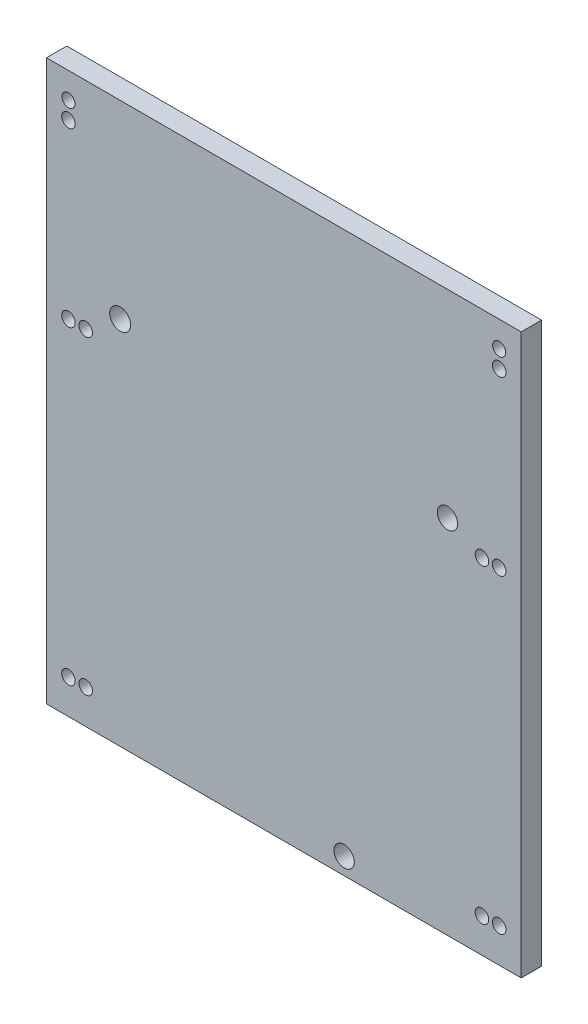
ISO-10303-21;
HEADER;
FILE_DESCRIPTION(('STEP AP214'),'2;1');
FILE_NAME('part.step','',(''),(''),'','','');
FILE_SCHEMA(('AUTOMOTIVE_DESIGN { 1 0 10303 214 1 1 1 1 }'));
ENDSEC;
DATA;
#1=APPLICATION_CONTEXT('core data for automotive mechanical design processes');
#2=APPLICATION_PROTOCOL_DEFINITION('international standard','automotive_design',2000,#1);
#3=PRODUCT_CONTEXT('',#1,'mechanical');
#4=PRODUCT('Part','Part','',(#3));
#5=PRODUCT_RELATED_PRODUCT_CATEGORY('part','',(#4));
#6=PRODUCT_DEFINITION_FORMATION('','',#4);
#7=PRODUCT_DEFINITION_CONTEXT('part definition',#1,'design');
#8=PRODUCT_DEFINITION('design','',#6,#7);
#9=PRODUCT_DEFINITION_SHAPE('','',#8);
#10=(LENGTH_UNIT() NAMED_UNIT(*) SI_UNIT(.MILLI.,.METRE.));
#11=(NAMED_UNIT(*) PLANE_ANGLE_UNIT() SI_UNIT($,.RADIAN.));
#12=(NAMED_UNIT(*) SI_UNIT($,.STERADIAN.) SOLID_ANGLE_UNIT());
#13=UNCERTAINTY_MEASURE_WITH_UNIT(LENGTH_MEASURE(1.E-05),#10,'distance_accuracy_value','');
#14=(GEOMETRIC_REPRESENTATION_CONTEXT(3) GLOBAL_UNCERTAINTY_ASSIGNED_CONTEXT((#13)) GLOBAL_UNIT_ASSIGNED_CONTEXT((#10,
#11,#12)) REPRESENTATION_CONTEXT('',''));
#15=CARTESIAN_POINT('',(0.,0.,0.));
#16=DIRECTION('',(0.,0.,1.));
#17=DIRECTION('',(1.,0.,0.));
#18=AXIS2_PLACEMENT_3D('',#15,#16,#17);
#19=CARTESIAN_POINT('',(0.,0.,3.));
#20=DIRECTION('',(0.,0.,-1.));
#21=DIRECTION('',(-1.,0.,0.));
#22=AXIS2_PLACEMENT_3D('',#19,#20,#21);
#23=PLANE('',#22);
#24=DIRECTION('',(0.,-1.,0.));
#25=VECTOR('',#24,1.);
#26=CARTESIAN_POINT('',(0.,0.,3.));
#27=LINE('',#26,#25);
#28=CARTESIAN_POINT('',(0.,82.5,3.));
#29=VERTEX_POINT('',#28);
#30=CARTESIAN_POINT('',(0.,0.,3.));
#31=VERTEX_POINT('',#30);
#32=EDGE_CURVE('E85',#29,#31,#27,.T.);
#33=ORIENTED_EDGE('',*,*,#32,.T.);
#34=DIRECTION('',(1.,0.,0.));
#35=VECTOR('',#34,1.);
#36=CARTESIAN_POINT('',(0.,0.,3.));
#37=LINE('',#36,#35);
#38=CARTESIAN_POINT('',(70.,0.,3.));
#39=VERTEX_POINT('',#38);
#40=EDGE_CURVE('E80',#31,#39,#37,.T.);
#41=ORIENTED_EDGE('',*,*,#40,.T.);
#42=DIRECTION('',(0.,1.,0.));
#43=VECTOR('',#42,1.);
#44=CARTESIAN_POINT('',(70.,0.,3.));
#45=LINE('',#44,#43);
#46=CARTESIAN_POINT('',(70.,82.5,3.));
#47=VERTEX_POINT('',#46);
#48=EDGE_CURVE('E83',#39,#47,#45,.T.);
#49=ORIENTED_EDGE('',*,*,#48,.T.);
#50=DIRECTION('',(-1.,0.,0.));
#51=VECTOR('',#50,1.);
#52=CARTESIAN_POINT('',(0.,82.5,3.));
#53=LINE('',#52,#51);
#54=EDGE_CURVE('E50',#47,#29,#53,.T.);
#55=ORIENTED_EDGE('',*,*,#54,.T.);
#56=EDGE_LOOP('',(#33,#41,#49,#55));
#57=FACE_BOUND('',#56,.T.);
#58=CARTESIAN_POINT('',(10.87,54.57,3.));
#59=DIRECTION('',(0.,0.,1.));
#60=DIRECTION('',(1.,0.,0.));
#61=AXIS2_PLACEMENT_3D('',#58,#59,#60);
#62=CIRCLE('',#61,1.54889262502123);
#63=CARTESIAN_POINT('',(12.4188926250212,54.57,3.));
#64=VERTEX_POINT('',#63);
#65=EDGE_CURVE('E100',#64,#64,#62,.T.);
#66=ORIENTED_EDGE('',*,*,#65,.F.);
#67=EDGE_LOOP('',(#66));
#68=FACE_BOUND('',#67,.T.);
#69=CARTESIAN_POINT('',(3.25,50.76,3.));
#70=DIRECTION('',(0.,0.,1.));
#71=DIRECTION('',(1.,0.,0.));
#72=AXIS2_PLACEMENT_3D('',#69,#70,#71);
#73=CIRCLE('',#72,1.);
#74=CARTESIAN_POINT('',(4.25,50.76,3.));
#75=VERTEX_POINT('',#74);
#76=EDGE_CURVE('E115',#75,#75,#73,.T.);
#77=ORIENTED_EDGE('',*,*,#76,.F.);
#78=EDGE_LOOP('',(#77));
#79=FACE_BOUND('',#78,.T.);
#80=CARTESIAN_POINT('',(59.13,53.3,3.));
#81=DIRECTION('',(0.,0.,1.));
#82=DIRECTION('',(1.,0.,0.));
#83=AXIS2_PLACEMENT_3D('',#80,#81,#82);
#84=CIRCLE('',#83,1.5);
#85=CARTESIAN_POINT('',(60.63,53.3,3.));
#86=VERTEX_POINT('',#85);
#87=EDGE_CURVE('E121',#86,#86,#84,.T.);
#88=ORIENTED_EDGE('',*,*,#87,.F.);
#89=EDGE_LOOP('',(#88));
#90=FACE_BOUND('',#89,.T.);
#91=CARTESIAN_POINT('',(43.89,2.5,3.));
#92=DIRECTION('',(0.,0.,1.));
#93=DIRECTION('',(1.,0.,0.));
#94=AXIS2_PLACEMENT_3D('',#91,#92,#93);
#95=CIRCLE('',#94,1.5);
#96=CARTESIAN_POINT('',(45.39,2.5,3.));
#97=VERTEX_POINT('',#96);
#98=EDGE_CURVE('E127',#97,#97,#95,.T.);
#99=ORIENTED_EDGE('',*,*,#98,.F.);
#100=EDGE_LOOP('',(#99));
#101=FACE_BOUND('',#100,.T.);
#102=CARTESIAN_POINT('',(3.25,78.7,3.));
#103=DIRECTION('',(0.,0.,1.));
#104=DIRECTION('',(1.,0.,0.));
#105=AXIS2_PLACEMENT_3D('',#102,#103,#104);
#106=CIRCLE('',#105,0.965612554052424);
#107=CARTESIAN_POINT('',(4.21561255405242,78.7,3.));
#108=VERTEX_POINT('',#107);
#109=EDGE_CURVE('E133',#108,#108,#106,.T.);
#110=ORIENTED_EDGE('',*,*,#109,.F.);
#111=EDGE_LOOP('',(#110));
#112=FACE_BOUND('',#111,.T.);
#113=CARTESIAN_POINT('',(3.25,76.16,3.));
#114=DIRECTION('',(0.,0.,1.));
#115=DIRECTION('',(1.,0.,0.));
#116=AXIS2_PLACEMENT_3D('',#113,#114,#115);
#117=CIRCLE('',#116,1.);
#118=CARTESIAN_POINT('',(4.25,76.16,3.));
#119=VERTEX_POINT('',#118);
#120=EDGE_CURVE('E139',#119,#119,#117,.T.);
#121=ORIENTED_EDGE('',*,*,#120,.F.);
#122=EDGE_LOOP('',(#121));
#123=FACE_BOUND('',#122,.T.);
#124=CARTESIAN_POINT('',(3.25,5.04,3.));
#125=DIRECTION('',(0.,0.,1.));
#126=DIRECTION('',(1.,0.,0.));
#127=AXIS2_PLACEMENT_3D('',#124,#125,#126);
#128=CIRCLE('',#127,1.);
#129=CARTESIAN_POINT('',(4.25,5.04,3.));
#130=VERTEX_POINT('',#129);
#131=EDGE_CURVE('E145',#130,#130,#128,.T.);
#132=ORIENTED_EDGE('',*,*,#131,.F.);
#133=EDGE_LOOP('',(#132));
#134=FACE_BOUND('',#133,.T.);
#135=CARTESIAN_POINT('',(66.75,78.7,3.));
#136=DIRECTION('',(0.,0.,1.));
#137=DIRECTION('',(1.,0.,0.));
#138=AXIS2_PLACEMENT_3D('',#135,#136,#137);
#139=CIRCLE('',#138,0.965612554052425);
#140=CARTESIAN_POINT('',(67.7156125540524,78.7,3.));
#141=VERTEX_POINT('',#140);
#142=EDGE_CURVE('E151',#141,#141,#139,.T.);
#143=ORIENTED_EDGE('',*,*,#142,.F.);
#144=EDGE_LOOP('',(#143));
#145=FACE_BOUND('',#144,.T.);
#146=CARTESIAN_POINT('',(66.75,76.16,3.));
#147=DIRECTION('',(0.,0.,1.));
#148=DIRECTION('',(1.,0.,0.));
#149=AXIS2_PLACEMENT_3D('',#146,#147,#148);
#150=CIRCLE('',#149,0.999999999999998);
#151=CARTESIAN_POINT('',(67.75,76.16,3.));
#152=VERTEX_POINT('',#151);
#153=EDGE_CURVE('E157',#152,#152,#150,.T.);
#154=ORIENTED_EDGE('',*,*,#153,.F.);
#155=EDGE_LOOP('',(#154));
#156=FACE_BOUND('',#155,.T.);
#157=CARTESIAN_POINT('',(5.79000000000001,5.04,3.));
#158=DIRECTION('',(0.,0.,1.));
#159=DIRECTION('',(1.,0.,0.));
#160=AXIS2_PLACEMENT_3D('',#157,#158,#159);
#161=CIRCLE('',#160,1.);
#162=CARTESIAN_POINT('',(6.79000000000001,5.04,3.));
#163=VERTEX_POINT('',#162);
#164=EDGE_CURVE('E163',#163,#163,#161,.T.);
#165=ORIENTED_EDGE('',*,*,#164,.F.);
#166=EDGE_LOOP('',(#165));
#167=FACE_BOUND('',#166,.T.);
#168=CARTESIAN_POINT('',(66.75,5.04,3.));
#169=DIRECTION('',(0.,0.,1.));
#170=DIRECTION('',(1.,0.,0.));
#171=AXIS2_PLACEMENT_3D('',#168,#169,#170);
#172=CIRCLE('',#171,0.999999999999998);
#173=CARTESIAN_POINT('',(67.75,5.04,3.));
#174=VERTEX_POINT('',#173);
#175=EDGE_CURVE('E169',#174,#174,#172,.T.);
#176=ORIENTED_EDGE('',*,*,#175,.F.);
#177=EDGE_LOOP('',(#176));
#178=FACE_BOUND('',#177,.T.);
#179=CARTESIAN_POINT('',(64.21,5.04,3.));
#180=DIRECTION('',(0.,0.,1.));
#181=DIRECTION('',(1.,0.,0.));
#182=AXIS2_PLACEMENT_3D('',#179,#180,#181);
#183=CIRCLE('',#182,1.00000000000001);
#184=CARTESIAN_POINT('',(65.21,5.04,3.));
#185=VERTEX_POINT('',#184);
#186=EDGE_CURVE('E175',#185,#185,#183,.T.);
#187=ORIENTED_EDGE('',*,*,#186,.F.);
#188=EDGE_LOOP('',(#187));
#189=FACE_BOUND('',#188,.T.);
#190=CARTESIAN_POINT('',(5.79,50.76,3.));
#191=DIRECTION('',(0.,0.,1.));
#192=DIRECTION('',(1.,0.,0.));
#193=AXIS2_PLACEMENT_3D('',#190,#191,#192);
#194=CIRCLE('',#193,1.);
#195=CARTESIAN_POINT('',(6.79,50.76,3.));
#196=VERTEX_POINT('',#195);
#197=EDGE_CURVE('E181',#196,#196,#194,.T.);
#198=ORIENTED_EDGE('',*,*,#197,.F.);
#199=EDGE_LOOP('',(#198));
#200=FACE_BOUND('',#199,.T.);
#201=CARTESIAN_POINT('',(66.75,50.76,3.));
#202=DIRECTION('',(0.,0.,1.));
#203=DIRECTION('',(1.,0.,0.));
#204=AXIS2_PLACEMENT_3D('',#201,#202,#203);
#205=CIRCLE('',#204,0.999999999999998);
#206=CARTESIAN_POINT('',(67.75,50.76,3.));
#207=VERTEX_POINT('',#206);
#208=EDGE_CURVE('E187',#207,#207,#205,.T.);
#209=ORIENTED_EDGE('',*,*,#208,.F.);
#210=EDGE_LOOP('',(#209));
#211=FACE_BOUND('',#210,.T.);
#212=CARTESIAN_POINT('',(64.21,50.76,3.));
#213=DIRECTION('',(0.,0.,1.));
#214=DIRECTION('',(1.,0.,0.));
#215=AXIS2_PLACEMENT_3D('',#212,#213,#214);
#216=CIRCLE('',#215,0.999999999999998);
#217=CARTESIAN_POINT('',(65.21,50.76,3.));
#218=VERTEX_POINT('',#217);
#219=EDGE_CURVE('E193',#218,#218,#216,.T.);
#220=ORIENTED_EDGE('',*,*,#219,.F.);
#221=EDGE_LOOP('',(#220));
#222=FACE_BOUND('',#221,.T.);
#223=ADVANCED_FACE('F33',(#57,#68,#79,#90,#101,#112,#123,#134,#145,#156,#167,#178,#189,#200,
#211,#222),#23,.F.);
#224=CARTESIAN_POINT('',(0.,0.,0.));
#225=DIRECTION('',(0.,0.,-1.));
#226=DIRECTION('',(-1.,0.,0.));
#227=AXIS2_PLACEMENT_3D('',#224,#225,#226);
#228=PLANE('',#227);
#229=CARTESIAN_POINT('',(66.75,50.76,0.));
#230=DIRECTION('',(0.,0.,1.));
#231=DIRECTION('',(1.,0.,0.));
#232=AXIS2_PLACEMENT_3D('',#229,#230,#231);
#233=CIRCLE('',#232,0.999999999999998);
#234=CARTESIAN_POINT('',(67.75,50.76,0.));
#235=VERTEX_POINT('',#234);
#236=EDGE_CURVE('E190',#235,#235,#233,.T.);
#237=ORIENTED_EDGE('',*,*,#236,.T.);
#238=EDGE_LOOP('',(#237));
#239=FACE_BOUND('',#238,.T.);
#240=CARTESIAN_POINT('',(64.21,5.04,0.));
#241=DIRECTION('',(0.,0.,1.));
#242=DIRECTION('',(1.,0.,0.));
#243=AXIS2_PLACEMENT_3D('',#240,#241,#242);
#244=CIRCLE('',#243,1.00000000000001);
#245=CARTESIAN_POINT('',(65.21,5.04,0.));
#246=VERTEX_POINT('',#245);
#247=EDGE_CURVE('E178',#246,#246,#244,.T.);
#248=ORIENTED_EDGE('',*,*,#247,.T.);
#249=EDGE_LOOP('',(#248));
#250=FACE_BOUND('',#249,.T.);
#251=CARTESIAN_POINT('',(5.79000000000001,5.04,0.));
#252=DIRECTION('',(0.,0.,1.));
#253=DIRECTION('',(1.,0.,0.));
#254=AXIS2_PLACEMENT_3D('',#251,#252,#253);
#255=CIRCLE('',#254,1.);
#256=CARTESIAN_POINT('',(6.79000000000001,5.04,0.));
#257=VERTEX_POINT('',#256);
#258=EDGE_CURVE('E166',#257,#257,#255,.T.);
#259=ORIENTED_EDGE('',*,*,#258,.T.);
#260=EDGE_LOOP('',(#259));
#261=FACE_BOUND('',#260,.T.);
#262=CARTESIAN_POINT('',(66.75,78.7,0.));
#263=DIRECTION('',(0.,0.,1.));
#264=DIRECTION('',(1.,0.,0.));
#265=AXIS2_PLACEMENT_3D('',#262,#263,#264);
#266=CIRCLE('',#265,0.965612554052425);
#267=CARTESIAN_POINT('',(67.7156125540524,78.7,0.));
#268=VERTEX_POINT('',#267);
#269=EDGE_CURVE('E154',#268,#268,#266,.T.);
#270=ORIENTED_EDGE('',*,*,#269,.T.);
#271=EDGE_LOOP('',(#270));
#272=FACE_BOUND('',#271,.T.);
#273=CARTESIAN_POINT('',(3.25,76.16,0.));
#274=DIRECTION('',(0.,0.,1.));
#275=DIRECTION('',(1.,0.,0.));
#276=AXIS2_PLACEMENT_3D('',#273,#274,#275);
#277=CIRCLE('',#276,1.);
#278=CARTESIAN_POINT('',(4.25,76.16,0.));
#279=VERTEX_POINT('',#278);
#280=EDGE_CURVE('E142',#279,#279,#277,.T.);
#281=ORIENTED_EDGE('',*,*,#280,.T.);
#282=EDGE_LOOP('',(#281));
#283=FACE_BOUND('',#282,.T.);
#284=CARTESIAN_POINT('',(43.89,2.5,0.));
#285=DIRECTION('',(0.,0.,1.));
#286=DIRECTION('',(1.,0.,0.));
#287=AXIS2_PLACEMENT_3D('',#284,#285,#286);
#288=CIRCLE('',#287,1.5);
#289=CARTESIAN_POINT('',(45.39,2.5,0.));
#290=VERTEX_POINT('',#289);
#291=EDGE_CURVE('E130',#290,#290,#288,.T.);
#292=ORIENTED_EDGE('',*,*,#291,.T.);
#293=EDGE_LOOP('',(#292));
#294=FACE_BOUND('',#293,.T.);
#295=CARTESIAN_POINT('',(3.25,50.76,0.));
#296=DIRECTION('',(0.,0.,1.));
#297=DIRECTION('',(1.,0.,0.));
#298=AXIS2_PLACEMENT_3D('',#295,#296,#297);
#299=CIRCLE('',#298,1.);
#300=CARTESIAN_POINT('',(4.25,50.76,0.));
#301=VERTEX_POINT('',#300);
#302=EDGE_CURVE('E118',#301,#301,#299,.T.);
#303=ORIENTED_EDGE('',*,*,#302,.T.);
#304=EDGE_LOOP('',(#303));
#305=FACE_BOUND('',#304,.T.);
#306=DIRECTION('',(0.,-1.,0.));
#307=VECTOR('',#306,1.);
#308=CARTESIAN_POINT('',(0.,0.,0.));
#309=LINE('',#308,#307);
#310=CARTESIAN_POINT('',(0.,82.5,0.));
#311=VERTEX_POINT('',#310);
#312=CARTESIAN_POINT('',(0.,0.,0.));
#313=VERTEX_POINT('',#312);
#314=EDGE_CURVE('E97',#311,#313,#309,.T.);
#315=ORIENTED_EDGE('',*,*,#314,.F.);
#316=DIRECTION('',(-1.,0.,0.));
#317=VECTOR('',#316,1.);
#318=CARTESIAN_POINT('',(0.,82.5,0.));
#319=LINE('',#318,#317);
#320=CARTESIAN_POINT('',(70.,82.5,0.));
#321=VERTEX_POINT('',#320);
#322=EDGE_CURVE('E73',#321,#311,#319,.T.);
#323=ORIENTED_EDGE('',*,*,#322,.F.);
#324=DIRECTION('',(0.,1.,0.));
#325=VECTOR('',#324,1.);
#326=CARTESIAN_POINT('',(70.,0.,0.));
#327=LINE('',#326,#325);
#328=CARTESIAN_POINT('',(70.,0.,0.));
#329=VERTEX_POINT('',#328);
#330=EDGE_CURVE('E67',#329,#321,#327,.T.);
#331=ORIENTED_EDGE('',*,*,#330,.F.);
#332=DIRECTION('',(1.,0.,0.));
#333=VECTOR('',#332,1.);
#334=CARTESIAN_POINT('',(0.,0.,0.));
#335=LINE('',#334,#333);
#336=EDGE_CURVE('E89',#313,#329,#335,.T.);
#337=ORIENTED_EDGE('',*,*,#336,.F.);
#338=EDGE_LOOP('',(#315,#323,#331,#337));
#339=FACE_BOUND('',#338,.T.);
#340=CARTESIAN_POINT('',(10.87,54.57,0.));
#341=DIRECTION('',(0.,0.,1.));
#342=DIRECTION('',(1.,0.,0.));
#343=AXIS2_PLACEMENT_3D('',#340,#341,#342);
#344=CIRCLE('',#343,1.54889262502123);
#345=CARTESIAN_POINT('',(12.4188926250212,54.57,0.));
#346=VERTEX_POINT('',#345);
#347=EDGE_CURVE('E112',#346,#346,#344,.T.);
#348=ORIENTED_EDGE('',*,*,#347,.T.);
#349=EDGE_LOOP('',(#348));
#350=FACE_BOUND('',#349,.T.);
#351=CARTESIAN_POINT('',(59.13,53.3,0.));
#352=DIRECTION('',(0.,0.,1.));
#353=DIRECTION('',(1.,0.,0.));
#354=AXIS2_PLACEMENT_3D('',#351,#352,#353);
#355=CIRCLE('',#354,1.5);
#356=CARTESIAN_POINT('',(60.63,53.3,0.));
#357=VERTEX_POINT('',#356);
#358=EDGE_CURVE('E124',#357,#357,#355,.T.);
#359=ORIENTED_EDGE('',*,*,#358,.T.);
#360=EDGE_LOOP('',(#359));
#361=FACE_BOUND('',#360,.T.);
#362=CARTESIAN_POINT('',(3.25,78.7,0.));
#363=DIRECTION('',(0.,0.,1.));
#364=DIRECTION('',(1.,0.,0.));
#365=AXIS2_PLACEMENT_3D('',#362,#363,#364);
#366=CIRCLE('',#365,0.965612554052424);
#367=CARTESIAN_POINT('',(4.21561255405242,78.7,0.));
#368=VERTEX_POINT('',#367);
#369=EDGE_CURVE('E136',#368,#368,#366,.T.);
#370=ORIENTED_EDGE('',*,*,#369,.T.);
#371=EDGE_LOOP('',(#370));
#372=FACE_BOUND('',#371,.T.);
#373=CARTESIAN_POINT('',(3.25,5.04,0.));
#374=DIRECTION('',(0.,0.,1.));
#375=DIRECTION('',(1.,0.,0.));
#376=AXIS2_PLACEMENT_3D('',#373,#374,#375);
#377=CIRCLE('',#376,1.);
#378=CARTESIAN_POINT('',(4.25,5.04,0.));
#379=VERTEX_POINT('',#378);
#380=EDGE_CURVE('E148',#379,#379,#377,.T.);
#381=ORIENTED_EDGE('',*,*,#380,.T.);
#382=EDGE_LOOP('',(#381));
#383=FACE_BOUND('',#382,.T.);
#384=CARTESIAN_POINT('',(66.75,76.16,0.));
#385=DIRECTION('',(0.,0.,1.));
#386=DIRECTION('',(1.,0.,0.));
#387=AXIS2_PLACEMENT_3D('',#384,#385,#386);
#388=CIRCLE('',#387,0.999999999999998);
#389=CARTESIAN_POINT('',(67.75,76.16,0.));
#390=VERTEX_POINT('',#389);
#391=EDGE_CURVE('E160',#390,#390,#388,.T.);
#392=ORIENTED_EDGE('',*,*,#391,.T.);
#393=EDGE_LOOP('',(#392));
#394=FACE_BOUND('',#393,.T.);
#395=CARTESIAN_POINT('',(66.75,5.04,0.));
#396=DIRECTION('',(0.,0.,1.));
#397=DIRECTION('',(1.,0.,0.));
#398=AXIS2_PLACEMENT_3D('',#395,#396,#397);
#399=CIRCLE('',#398,0.999999999999998);
#400=CARTESIAN_POINT('',(67.75,5.04,0.));
#401=VERTEX_POINT('',#400);
#402=EDGE_CURVE('E172',#401,#401,#399,.T.);
#403=ORIENTED_EDGE('',*,*,#402,.T.);
#404=EDGE_LOOP('',(#403));
#405=FACE_BOUND('',#404,.T.);
#406=CARTESIAN_POINT('',(5.79,50.76,0.));
#407=DIRECTION('',(0.,0.,1.));
#408=DIRECTION('',(1.,0.,0.));
#409=AXIS2_PLACEMENT_3D('',#406,#407,#408);
#410=CIRCLE('',#409,1.);
#411=CARTESIAN_POINT('',(6.79,50.76,0.));
#412=VERTEX_POINT('',#411);
#413=EDGE_CURVE('E184',#412,#412,#410,.T.);
#414=ORIENTED_EDGE('',*,*,#413,.T.);
#415=EDGE_LOOP('',(#414));
#416=FACE_BOUND('',#415,.T.);
#417=CARTESIAN_POINT('',(64.21,50.76,0.));
#418=DIRECTION('',(0.,0.,1.));
#419=DIRECTION('',(1.,0.,0.));
#420=AXIS2_PLACEMENT_3D('',#417,#418,#419);
#421=CIRCLE('',#420,0.999999999999998);
#422=CARTESIAN_POINT('',(65.21,50.76,0.));
#423=VERTEX_POINT('',#422);
#424=EDGE_CURVE('E196',#423,#423,#421,.T.);
#425=ORIENTED_EDGE('',*,*,#424,.T.);
#426=EDGE_LOOP('',(#425));
#427=FACE_BOUND('',#426,.T.);
#428=ADVANCED_FACE('F108',(#239,#250,#261,#272,#283,#294,#305,#339,#350,#361,#372,#383,#394,
#405,#416,#427),#228,.T.);
#429=CARTESIAN_POINT('',(0.,0.,3.));
#430=DIRECTION('',(1.,0.,0.));
#431=DIRECTION('',(0.,0.,-1.));
#432=AXIS2_PLACEMENT_3D('',#429,#430,#431);
#433=PLANE('',#432);
#434=ORIENTED_EDGE('',*,*,#314,.T.);
#435=DIRECTION('',(0.,0.,-1.));
#436=VECTOR('',#435,1.);
#437=CARTESIAN_POINT('',(0.,0.,3.));
#438=LINE('',#437,#436);
#439=EDGE_CURVE('E11',#31,#313,#438,.T.);
#440=ORIENTED_EDGE('',*,*,#439,.F.);
#441=ORIENTED_EDGE('',*,*,#32,.F.);
#442=DIRECTION('',(0.,0.,-1.));
#443=VECTOR('',#442,1.);
#444=CARTESIAN_POINT('',(0.,82.5,3.));
#445=LINE('',#444,#443);
#446=EDGE_CURVE('E93',#29,#311,#445,.T.);
#447=ORIENTED_EDGE('',*,*,#446,.T.);
#448=EDGE_LOOP('',(#434,#440,#441,#447));
#449=FACE_BOUND('',#448,.T.);
#450=ADVANCED_FACE('F35',(#449),#433,.F.);
#451=CARTESIAN_POINT('',(0.,0.,3.));
#452=DIRECTION('',(0.,1.,0.));
#453=DIRECTION('',(0.,0.,1.));
#454=AXIS2_PLACEMENT_3D('',#451,#452,#453);
#455=PLANE('',#454);
#456=ORIENTED_EDGE('',*,*,#336,.T.);
#457=DIRECTION('',(0.,0.,-1.));
#458=VECTOR('',#457,1.);
#459=CARTESIAN_POINT('',(70.,0.,3.));
#460=LINE('',#459,#458);
#461=EDGE_CURVE('E42',#39,#329,#460,.T.);
#462=ORIENTED_EDGE('',*,*,#461,.F.);
#463=ORIENTED_EDGE('',*,*,#40,.F.);
#464=ORIENTED_EDGE('',*,*,#439,.T.);
#465=EDGE_LOOP('',(#456,#462,#463,#464));
#466=FACE_BOUND('',#465,.T.);
#467=ADVANCED_FACE('F88',(#466),#455,.F.);
#468=CARTESIAN_POINT('',(70.,0.,3.));
#469=DIRECTION('',(-1.,0.,0.));
#470=DIRECTION('',(0.,0.,1.));
#471=AXIS2_PLACEMENT_3D('',#468,#469,#470);
#472=PLANE('',#471);
#473=ORIENTED_EDGE('',*,*,#330,.T.);
#474=DIRECTION('',(0.,0.,-1.));
#475=VECTOR('',#474,1.);
#476=CARTESIAN_POINT('',(70.,82.5,3.));
#477=LINE('',#476,#475);
#478=EDGE_CURVE('E90',#47,#321,#477,.T.);
#479=ORIENTED_EDGE('',*,*,#478,.F.);
#480=ORIENTED_EDGE('',*,*,#48,.F.);
#481=ORIENTED_EDGE('',*,*,#461,.T.);
#482=EDGE_LOOP('',(#473,#479,#480,#481));
#483=FACE_BOUND('',#482,.T.);
#484=ADVANCED_FACE('F91',(#483),#472,.F.);
#485=CARTESIAN_POINT('',(0.,82.5,3.));
#486=DIRECTION('',(0.,-1.,0.));
#487=DIRECTION('',(0.,0.,-1.));
#488=AXIS2_PLACEMENT_3D('',#485,#486,#487);
#489=PLANE('',#488);
#490=ORIENTED_EDGE('',*,*,#322,.T.);
#491=ORIENTED_EDGE('',*,*,#446,.F.);
#492=ORIENTED_EDGE('',*,*,#54,.F.);
#493=ORIENTED_EDGE('',*,*,#478,.T.);
#494=EDGE_LOOP('',(#490,#491,#492,#493));
#495=FACE_BOUND('',#494,.T.);
#496=ADVANCED_FACE('F105',(#495),#489,.F.);
#497=CARTESIAN_POINT('',(10.87,54.57,3.));
#498=DIRECTION('',(0.,0.,-1.));
#499=DIRECTION('',(-1.,0.,0.));
#500=AXIS2_PLACEMENT_3D('',#497,#498,#499);
#501=CYLINDRICAL_SURFACE('',#500,1.54889262502123);
#502=ORIENTED_EDGE('',*,*,#65,.T.);
#503=EDGE_LOOP('',(#502));
#504=FACE_BOUND('',#503,.T.);
#505=ORIENTED_EDGE('',*,*,#347,.F.);
#506=EDGE_LOOP('',(#505));
#507=FACE_BOUND('',#506,.T.);
#508=ADVANCED_FACE('F213',(#504,#507),#501,.F.);
#509=CARTESIAN_POINT('',(3.25,50.76,3.));
#510=DIRECTION('',(0.,0.,-1.));
#511=DIRECTION('',(-1.,0.,0.));
#512=AXIS2_PLACEMENT_3D('',#509,#510,#511);
#513=CYLINDRICAL_SURFACE('',#512,1.);
#514=ORIENTED_EDGE('',*,*,#76,.T.);
#515=EDGE_LOOP('',(#514));
#516=FACE_BOUND('',#515,.T.);
#517=ORIENTED_EDGE('',*,*,#302,.F.);
#518=EDGE_LOOP('',(#517));
#519=FACE_BOUND('',#518,.T.);
#520=ADVANCED_FACE('F259',(#516,#519),#513,.F.);
#521=CARTESIAN_POINT('',(59.13,53.3,3.));
#522=DIRECTION('',(0.,0.,-1.));
#523=DIRECTION('',(-1.,0.,0.));
#524=AXIS2_PLACEMENT_3D('',#521,#522,#523);
#525=CYLINDRICAL_SURFACE('',#524,1.5);
#526=ORIENTED_EDGE('',*,*,#87,.T.);
#527=EDGE_LOOP('',(#526));
#528=FACE_BOUND('',#527,.T.);
#529=ORIENTED_EDGE('',*,*,#358,.F.);
#530=EDGE_LOOP('',(#529));
#531=FACE_BOUND('',#530,.T.);
#532=ADVANCED_FACE('F267',(#528,#531),#525,.F.);
#533=CARTESIAN_POINT('',(43.89,2.5,3.));
#534=DIRECTION('',(0.,0.,-1.));
#535=DIRECTION('',(-1.,0.,0.));
#536=AXIS2_PLACEMENT_3D('',#533,#534,#535);
#537=CYLINDRICAL_SURFACE('',#536,1.5);
#538=ORIENTED_EDGE('',*,*,#98,.T.);
#539=EDGE_LOOP('',(#538));
#540=FACE_BOUND('',#539,.T.);
#541=ORIENTED_EDGE('',*,*,#291,.F.);
#542=EDGE_LOOP('',(#541));
#543=FACE_BOUND('',#542,.T.);
#544=ADVANCED_FACE('F275',(#540,#543),#537,.F.);
#545=CARTESIAN_POINT('',(3.25,78.7,3.));
#546=DIRECTION('',(0.,0.,-1.));
#547=DIRECTION('',(-1.,0.,0.));
#548=AXIS2_PLACEMENT_3D('',#545,#546,#547);
#549=CYLINDRICAL_SURFACE('',#548,0.965612554052424);
#550=ORIENTED_EDGE('',*,*,#109,.T.);
#551=EDGE_LOOP('',(#550));
#552=FACE_BOUND('',#551,.T.);
#553=ORIENTED_EDGE('',*,*,#369,.F.);
#554=EDGE_LOOP('',(#553));
#555=FACE_BOUND('',#554,.T.);
#556=ADVANCED_FACE('F284',(#552,#555),#549,.F.);
#557=CARTESIAN_POINT('',(3.25,76.16,3.));
#558=DIRECTION('',(0.,0.,-1.));
#559=DIRECTION('',(-1.,0.,0.));
#560=AXIS2_PLACEMENT_3D('',#557,#558,#559);
#561=CYLINDRICAL_SURFACE('',#560,1.);
#562=ORIENTED_EDGE('',*,*,#120,.T.);
#563=EDGE_LOOP('',(#562));
#564=FACE_BOUND('',#563,.T.);
#565=ORIENTED_EDGE('',*,*,#280,.F.);
#566=EDGE_LOOP('',(#565));
#567=FACE_BOUND('',#566,.T.);
#568=ADVANCED_FACE('F293',(#564,#567),#561,.F.);
#569=CARTESIAN_POINT('',(3.25,5.04,3.));
#570=DIRECTION('',(0.,0.,-1.));
#571=DIRECTION('',(-1.,0.,0.));
#572=AXIS2_PLACEMENT_3D('',#569,#570,#571);
#573=CYLINDRICAL_SURFACE('',#572,1.);
#574=ORIENTED_EDGE('',*,*,#131,.T.);
#575=EDGE_LOOP('',(#574));
#576=FACE_BOUND('',#575,.T.);
#577=ORIENTED_EDGE('',*,*,#380,.F.);
#578=EDGE_LOOP('',(#577));
#579=FACE_BOUND('',#578,.T.);
#580=ADVANCED_FACE('F302',(#576,#579),#573,.F.);
#581=CARTESIAN_POINT('',(66.75,78.7,3.));
#582=DIRECTION('',(0.,0.,-1.));
#583=DIRECTION('',(-1.,0.,0.));
#584=AXIS2_PLACEMENT_3D('',#581,#582,#583);
#585=CYLINDRICAL_SURFACE('',#584,0.965612554052425);
#586=ORIENTED_EDGE('',*,*,#142,.T.);
#587=EDGE_LOOP('',(#586));
#588=FACE_BOUND('',#587,.T.);
#589=ORIENTED_EDGE('',*,*,#269,.F.);
#590=EDGE_LOOP('',(#589));
#591=FACE_BOUND('',#590,.T.);
#592=ADVANCED_FACE('F311',(#588,#591),#585,.F.);
#593=CARTESIAN_POINT('',(66.75,76.16,3.));
#594=DIRECTION('',(0.,0.,-1.));
#595=DIRECTION('',(-1.,0.,0.));
#596=AXIS2_PLACEMENT_3D('',#593,#594,#595);
#597=CYLINDRICAL_SURFACE('',#596,0.999999999999998);
#598=ORIENTED_EDGE('',*,*,#153,.T.);
#599=EDGE_LOOP('',(#598));
#600=FACE_BOUND('',#599,.T.);
#601=ORIENTED_EDGE('',*,*,#391,.F.);
#602=EDGE_LOOP('',(#601));
#603=FACE_BOUND('',#602,.T.);
#604=ADVANCED_FACE('F320',(#600,#603),#597,.F.);
#605=CARTESIAN_POINT('',(5.79000000000001,5.04,3.));
#606=DIRECTION('',(0.,0.,-1.));
#607=DIRECTION('',(-1.,0.,0.));
#608=AXIS2_PLACEMENT_3D('',#605,#606,#607);
#609=CYLINDRICAL_SURFACE('',#608,1.);
#610=ORIENTED_EDGE('',*,*,#164,.T.);
#611=EDGE_LOOP('',(#610));
#612=FACE_BOUND('',#611,.T.);
#613=ORIENTED_EDGE('',*,*,#258,.F.);
#614=EDGE_LOOP('',(#613));
#615=FACE_BOUND('',#614,.T.);
#616=ADVANCED_FACE('F329',(#612,#615),#609,.F.);
#617=CARTESIAN_POINT('',(66.75,5.04,3.));
#618=DIRECTION('',(0.,0.,-1.));
#619=DIRECTION('',(-1.,0.,0.));
#620=AXIS2_PLACEMENT_3D('',#617,#618,#619);
#621=CYLINDRICAL_SURFACE('',#620,0.999999999999998);
#622=ORIENTED_EDGE('',*,*,#175,.T.);
#623=EDGE_LOOP('',(#622));
#624=FACE_BOUND('',#623,.T.);
#625=ORIENTED_EDGE('',*,*,#402,.F.);
#626=EDGE_LOOP('',(#625));
#627=FACE_BOUND('',#626,.T.);
#628=ADVANCED_FACE('F338',(#624,#627),#621,.F.);
#629=CARTESIAN_POINT('',(64.21,5.04,3.));
#630=DIRECTION('',(0.,0.,-1.));
#631=DIRECTION('',(-1.,0.,0.));
#632=AXIS2_PLACEMENT_3D('',#629,#630,#631);
#633=CYLINDRICAL_SURFACE('',#632,1.00000000000001);
#634=ORIENTED_EDGE('',*,*,#186,.T.);
#635=EDGE_LOOP('',(#634));
#636=FACE_BOUND('',#635,.T.);
#637=ORIENTED_EDGE('',*,*,#247,.F.);
#638=EDGE_LOOP('',(#637));
#639=FACE_BOUND('',#638,.T.);
#640=ADVANCED_FACE('F347',(#636,#639),#633,.F.);
#641=CARTESIAN_POINT('',(5.79,50.76,3.));
#642=DIRECTION('',(0.,0.,-1.));
#643=DIRECTION('',(-1.,0.,0.));
#644=AXIS2_PLACEMENT_3D('',#641,#642,#643);
#645=CYLINDRICAL_SURFACE('',#644,1.);
#646=ORIENTED_EDGE('',*,*,#197,.T.);
#647=EDGE_LOOP('',(#646));
#648=FACE_BOUND('',#647,.T.);
#649=ORIENTED_EDGE('',*,*,#413,.F.);
#650=EDGE_LOOP('',(#649));
#651=FACE_BOUND('',#650,.T.);
#652=ADVANCED_FACE('F356',(#648,#651),#645,.F.);
#653=CARTESIAN_POINT('',(66.75,50.76,3.));
#654=DIRECTION('',(0.,0.,-1.));
#655=DIRECTION('',(-1.,0.,0.));
#656=AXIS2_PLACEMENT_3D('',#653,#654,#655);
#657=CYLINDRICAL_SURFACE('',#656,0.999999999999998);
#658=ORIENTED_EDGE('',*,*,#208,.T.);
#659=EDGE_LOOP('',(#658));
#660=FACE_BOUND('',#659,.T.);
#661=ORIENTED_EDGE('',*,*,#236,.F.);
#662=EDGE_LOOP('',(#661));
#663=FACE_BOUND('',#662,.T.);
#664=ADVANCED_FACE('F365',(#660,#663),#657,.F.);
#665=CARTESIAN_POINT('',(64.21,50.76,3.));
#666=DIRECTION('',(0.,0.,-1.));
#667=DIRECTION('',(-1.,0.,0.));
#668=AXIS2_PLACEMENT_3D('',#665,#666,#667);
#669=CYLINDRICAL_SURFACE('',#668,0.999999999999998);
#670=ORIENTED_EDGE('',*,*,#219,.T.);
#671=EDGE_LOOP('',(#670));
#672=FACE_BOUND('',#671,.T.);
#673=ORIENTED_EDGE('',*,*,#424,.F.);
#674=EDGE_LOOP('',(#673));
#675=FACE_BOUND('',#674,.T.);
#676=ADVANCED_FACE('F202',(#672,#675),#669,.F.);
#677=CLOSED_SHELL('',(#223,#428,#450,#467,#484,#496,#508,#520,#532,#544,#556,#568,#580,#592,
#604,#616,#628,#640,#652,#664,#676));
#678=MANIFOLD_SOLID_BREP('B2',#677);
#679=ADVANCED_BREP_SHAPE_REPRESENTATION('',(#18,#678),#14);
#680=SHAPE_DEFINITION_REPRESENTATION(#9,#679);
ENDSEC;
END-ISO-10303-21;
